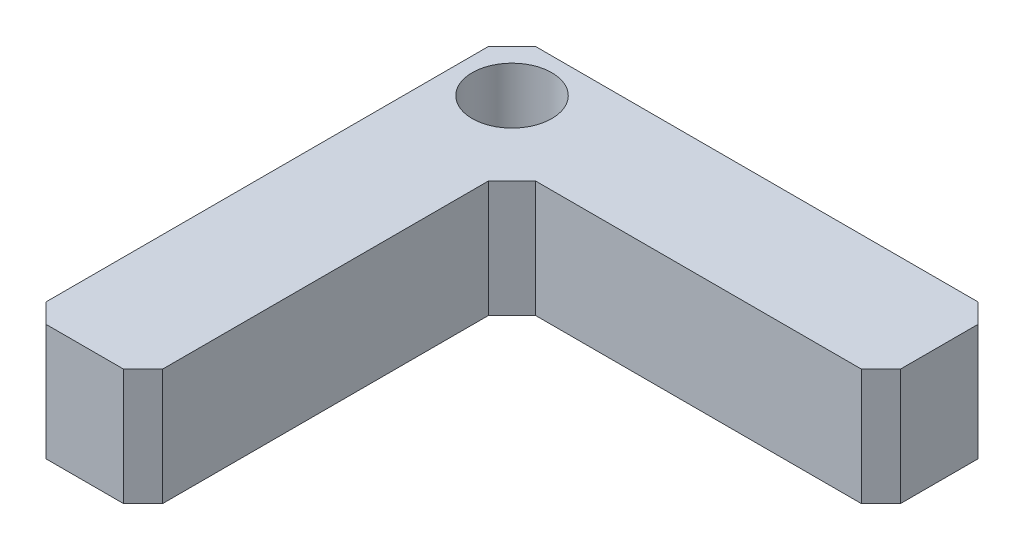
ISO-10303-21;
HEADER;
FILE_DESCRIPTION(('STEP AP214'),'2;1');
FILE_NAME('part.step','',(''),(''),'','','');
FILE_SCHEMA(('AUTOMOTIVE_DESIGN { 1 0 10303 214 1 1 1 1 }'));
ENDSEC;
DATA;
#1=APPLICATION_CONTEXT('core data for automotive mechanical design processes');
#2=APPLICATION_PROTOCOL_DEFINITION('international standard','automotive_design',2000,#1);
#3=PRODUCT_CONTEXT('',#1,'mechanical');
#4=PRODUCT('Part','Part','',(#3));
#5=PRODUCT_RELATED_PRODUCT_CATEGORY('part','',(#4));
#6=PRODUCT_DEFINITION_FORMATION('','',#4);
#7=PRODUCT_DEFINITION_CONTEXT('part definition',#1,'design');
#8=PRODUCT_DEFINITION('design','',#6,#7);
#9=PRODUCT_DEFINITION_SHAPE('','',#8);
#10=(LENGTH_UNIT() NAMED_UNIT(*) SI_UNIT(.MILLI.,.METRE.));
#11=(NAMED_UNIT(*) PLANE_ANGLE_UNIT() SI_UNIT($,.RADIAN.));
#12=(NAMED_UNIT(*) SI_UNIT($,.STERADIAN.) SOLID_ANGLE_UNIT());
#13=UNCERTAINTY_MEASURE_WITH_UNIT(LENGTH_MEASURE(1.E-05),#10,'distance_accuracy_value','');
#14=(GEOMETRIC_REPRESENTATION_CONTEXT(3) GLOBAL_UNCERTAINTY_ASSIGNED_CONTEXT((#13)) GLOBAL_UNIT_ASSIGNED_CONTEXT((#10,
#11,#12)) REPRESENTATION_CONTEXT('',''));
#15=CARTESIAN_POINT('',(0.,0.,0.));
#16=DIRECTION('',(0.,0.,1.));
#17=DIRECTION('',(1.,0.,0.));
#18=AXIS2_PLACEMENT_3D('',#15,#16,#17);
#19=CARTESIAN_POINT('',(-31.5,15.,31.5));
#20=DIRECTION('',(0.707106781186548,0.,-0.707106781186547));
#21=DIRECTION('',(-0.707106781186547,0.,-0.707106781186548));
#22=AXIS2_PLACEMENT_3D('',#19,#20,#21);
#23=PLANE('',#22);
#24=DIRECTION('',(0.707106781186547,0.,0.707106781186548));
#25=VECTOR('',#24,1.);
#26=CARTESIAN_POINT('',(-31.5,0.,31.5));
#27=LINE('',#26,#25);
#28=CARTESIAN_POINT('',(-2.99999999999999,0.,60.));
#29=VERTEX_POINT('',#28);
#30=CARTESIAN_POINT('',(-0.499999999999994,0.,62.5));
#31=VERTEX_POINT('',#30);
#32=EDGE_CURVE('E171',#29,#31,#27,.T.);
#33=ORIENTED_EDGE('',*,*,#32,.T.);
#34=DIRECTION('',(0.,-1.,0.));
#35=VECTOR('',#34,1.);
#36=CARTESIAN_POINT('',(-0.499999999999994,15.,62.5));
#37=LINE('',#36,#35);
#38=CARTESIAN_POINT('',(-0.499999999999994,15.,62.5));
#39=VERTEX_POINT('',#38);
#40=EDGE_CURVE('E11',#39,#31,#37,.T.);
#41=ORIENTED_EDGE('',*,*,#40,.F.);
#42=DIRECTION('',(0.707106781186547,0.,0.707106781186548));
#43=VECTOR('',#42,1.);
#44=CARTESIAN_POINT('',(-31.5,15.,31.5));
#45=LINE('',#44,#43);
#46=CARTESIAN_POINT('',(-2.99999999999999,15.,60.));
#47=VERTEX_POINT('',#46);
#48=EDGE_CURVE('E239',#47,#39,#45,.T.);
#49=ORIENTED_EDGE('',*,*,#48,.F.);
#50=DIRECTION('',(0.,-1.,0.));
#51=VECTOR('',#50,1.);
#52=CARTESIAN_POINT('',(-2.99999999999999,15.,60.));
#53=LINE('',#52,#51);
#54=EDGE_CURVE('E167',#47,#29,#53,.T.);
#55=ORIENTED_EDGE('',*,*,#54,.T.);
#56=EDGE_LOOP('',(#33,#41,#49,#55));
#57=FACE_BOUND('',#56,.T.);
#58=ADVANCED_FACE('F45',(#57),#23,.F.);
#59=CARTESIAN_POINT('',(0.,15.,62.5));
#60=DIRECTION('',(0.,0.,-1.));
#61=DIRECTION('',(-1.,0.,0.));
#62=AXIS2_PLACEMENT_3D('',#59,#60,#61);
#63=PLANE('',#62);
#64=DIRECTION('',(1.,0.,0.));
#65=VECTOR('',#64,1.);
#66=CARTESIAN_POINT('',(0.,0.,62.5));
#67=LINE('',#66,#65);
#68=CARTESIAN_POINT('',(9.50000000000001,0.,62.5));
#69=VERTEX_POINT('',#68);
#70=EDGE_CURVE('E174',#31,#69,#67,.T.);
#71=ORIENTED_EDGE('',*,*,#70,.T.);
#72=DIRECTION('',(0.,-1.,0.));
#73=VECTOR('',#72,1.);
#74=CARTESIAN_POINT('',(9.50000000000001,15.,62.5));
#75=LINE('',#74,#73);
#76=CARTESIAN_POINT('',(9.50000000000001,15.,62.5));
#77=VERTEX_POINT('',#76);
#78=EDGE_CURVE('E54',#77,#69,#75,.T.);
#79=ORIENTED_EDGE('',*,*,#78,.F.);
#80=DIRECTION('',(1.,0.,0.));
#81=VECTOR('',#80,1.);
#82=CARTESIAN_POINT('',(0.,15.,62.5));
#83=LINE('',#82,#81);
#84=EDGE_CURVE('E116',#39,#77,#83,.T.);
#85=ORIENTED_EDGE('',*,*,#84,.F.);
#86=ORIENTED_EDGE('',*,*,#40,.T.);
#87=EDGE_LOOP('',(#71,#79,#85,#86));
#88=FACE_BOUND('',#87,.T.);
#89=ADVANCED_FACE('F222',(#88),#63,.F.);
#90=CARTESIAN_POINT('',(36.,15.,36.));
#91=DIRECTION('',(0.707106781186548,0.,0.707106781186547));
#92=DIRECTION('',(0.707106781186547,0.,-0.707106781186548));
#93=AXIS2_PLACEMENT_3D('',#90,#91,#92);
#94=PLANE('',#93);
#95=DIRECTION('',(-0.707106781186547,0.,0.707106781186548));
#96=VECTOR('',#95,1.);
#97=CARTESIAN_POINT('',(36.,0.,36.));
#98=LINE('',#97,#96);
#99=CARTESIAN_POINT('',(12.,0.,60.));
#100=VERTEX_POINT('',#99);
#101=EDGE_CURVE('E177',#100,#69,#98,.T.);
#102=ORIENTED_EDGE('',*,*,#101,.F.);
#103=DIRECTION('',(0.,-1.,0.));
#104=VECTOR('',#103,1.);
#105=CARTESIAN_POINT('',(12.,15.,60.));
#106=LINE('',#105,#104);
#107=CARTESIAN_POINT('',(12.,15.,60.));
#108=VERTEX_POINT('',#107);
#109=EDGE_CURVE('E215',#108,#100,#106,.T.);
#110=ORIENTED_EDGE('',*,*,#109,.F.);
#111=DIRECTION('',(-0.707106781186547,0.,0.707106781186548));
#112=VECTOR('',#111,1.);
#113=CARTESIAN_POINT('',(36.,15.,36.));
#114=LINE('',#113,#112);
#115=EDGE_CURVE('E221',#108,#77,#114,.T.);
#116=ORIENTED_EDGE('',*,*,#115,.T.);
#117=ORIENTED_EDGE('',*,*,#78,.T.);
#118=EDGE_LOOP('',(#102,#110,#116,#117));
#119=FACE_BOUND('',#118,.T.);
#120=ADVANCED_FACE('F219',(#119),#94,.T.);
#121=CARTESIAN_POINT('',(12.,15.,0.));
#122=DIRECTION('',(1.,0.,0.));
#123=DIRECTION('',(0.,0.,-1.));
#124=AXIS2_PLACEMENT_3D('',#121,#122,#123);
#125=PLANE('',#124);
#126=DIRECTION('',(0.,0.,1.));
#127=VECTOR('',#126,1.);
#128=CARTESIAN_POINT('',(12.,0.,0.));
#129=LINE('',#128,#127);
#130=CARTESIAN_POINT('',(12.,0.,17.998132752231));
#131=VERTEX_POINT('',#130);
#132=EDGE_CURVE('E180',#131,#100,#129,.T.);
#133=ORIENTED_EDGE('',*,*,#132,.F.);
#134=DIRECTION('',(0.,-1.,0.));
#135=VECTOR('',#134,1.);
#136=CARTESIAN_POINT('',(12.,15.,17.998132752231));
#137=LINE('',#136,#135);
#138=CARTESIAN_POINT('',(12.,15.,17.998132752231));
#139=VERTEX_POINT('',#138);
#140=EDGE_CURVE('E213',#139,#131,#137,.T.);
#141=ORIENTED_EDGE('',*,*,#140,.F.);
#142=DIRECTION('',(0.,0.,1.));
#143=VECTOR('',#142,1.);
#144=CARTESIAN_POINT('',(12.,15.,0.));
#145=LINE('',#144,#143);
#146=EDGE_CURVE('E233',#139,#108,#145,.T.);
#147=ORIENTED_EDGE('',*,*,#146,.T.);
#148=ORIENTED_EDGE('',*,*,#109,.T.);
#149=EDGE_LOOP('',(#133,#141,#147,#148));
#150=FACE_BOUND('',#149,.T.);
#151=ADVANCED_FACE('F230',(#150),#125,.T.);
#152=CARTESIAN_POINT('',(14.9990663761155,15.,14.9990663761155));
#153=DIRECTION('',(0.707106781186547,0.,0.707106781186547));
#154=DIRECTION('',(0.707106781186548,0.,-0.707106781186548));
#155=AXIS2_PLACEMENT_3D('',#152,#153,#154);
#156=PLANE('',#155);
#157=DIRECTION('',(-0.707106781186548,0.,0.707106781186548));
#158=VECTOR('',#157,1.);
#159=CARTESIAN_POINT('',(14.9990663761155,0.,14.9990663761155));
#160=LINE('',#159,#158);
#161=CARTESIAN_POINT('',(14.998132752231,0.,15.));
#162=VERTEX_POINT('',#161);
#163=EDGE_CURVE('E183',#162,#131,#160,.T.);
#164=ORIENTED_EDGE('',*,*,#163,.F.);
#165=DIRECTION('',(0.,-1.,0.));
#166=VECTOR('',#165,1.);
#167=CARTESIAN_POINT('',(14.998132752231,15.,15.));
#168=LINE('',#167,#166);
#169=CARTESIAN_POINT('',(14.998132752231,15.,15.));
#170=VERTEX_POINT('',#169);
#171=EDGE_CURVE('E211',#170,#162,#168,.T.);
#172=ORIENTED_EDGE('',*,*,#171,.F.);
#173=DIRECTION('',(-0.707106781186548,0.,0.707106781186548));
#174=VECTOR('',#173,1.);
#175=CARTESIAN_POINT('',(14.9990663761155,15.,14.9990663761155));
#176=LINE('',#175,#174);
#177=EDGE_CURVE('E237',#170,#139,#176,.T.);
#178=ORIENTED_EDGE('',*,*,#177,.T.);
#179=ORIENTED_EDGE('',*,*,#140,.T.);
#180=EDGE_LOOP('',(#164,#172,#178,#179));
#181=FACE_BOUND('',#180,.T.);
#182=ADVANCED_FACE('F283',(#181),#156,.T.);
#183=CARTESIAN_POINT('',(0.,15.,15.));
#184=DIRECTION('',(0.,0.,1.));
#185=DIRECTION('',(1.,0.,0.));
#186=AXIS2_PLACEMENT_3D('',#183,#184,#185);
#187=PLANE('',#186);
#188=DIRECTION('',(-1.,0.,0.));
#189=VECTOR('',#188,1.);
#190=CARTESIAN_POINT('',(0.,0.,15.));
#191=LINE('',#190,#189);
#192=CARTESIAN_POINT('',(57.,0.,15.));
#193=VERTEX_POINT('',#192);
#194=EDGE_CURVE('E186',#193,#162,#191,.T.);
#195=ORIENTED_EDGE('',*,*,#194,.F.);
#196=DIRECTION('',(0.,-1.,0.));
#197=VECTOR('',#196,1.);
#198=CARTESIAN_POINT('',(57.,15.,15.));
#199=LINE('',#198,#197);
#200=CARTESIAN_POINT('',(57.,15.,15.));
#201=VERTEX_POINT('',#200);
#202=EDGE_CURVE('E209',#201,#193,#199,.T.);
#203=ORIENTED_EDGE('',*,*,#202,.F.);
#204=DIRECTION('',(-1.,0.,0.));
#205=VECTOR('',#204,1.);
#206=CARTESIAN_POINT('',(0.,15.,15.));
#207=LINE('',#206,#205);
#208=EDGE_CURVE('E244',#201,#170,#207,.T.);
#209=ORIENTED_EDGE('',*,*,#208,.T.);
#210=ORIENTED_EDGE('',*,*,#171,.T.);
#211=EDGE_LOOP('',(#195,#203,#209,#210));
#212=FACE_BOUND('',#211,.T.);
#213=ADVANCED_FACE('F286',(#212),#187,.T.);
#214=CARTESIAN_POINT('',(36.,15.,36.));
#215=DIRECTION('',(0.707106781186547,0.,0.707106781186547));
#216=DIRECTION('',(0.707106781186548,0.,-0.707106781186548));
#217=AXIS2_PLACEMENT_3D('',#214,#215,#216);
#218=PLANE('',#217);
#219=DIRECTION('',(-0.707106781186548,0.,0.707106781186548));
#220=VECTOR('',#219,1.);
#221=CARTESIAN_POINT('',(36.,0.,36.));
#222=LINE('',#221,#220);
#223=CARTESIAN_POINT('',(59.5,0.,12.5));
#224=VERTEX_POINT('',#223);
#225=EDGE_CURVE('E189',#224,#193,#222,.T.);
#226=ORIENTED_EDGE('',*,*,#225,.F.);
#227=DIRECTION('',(0.,-1.,0.));
#228=VECTOR('',#227,1.);
#229=CARTESIAN_POINT('',(59.5,15.,12.5));
#230=LINE('',#229,#228);
#231=CARTESIAN_POINT('',(59.5,15.,12.5));
#232=VERTEX_POINT('',#231);
#233=EDGE_CURVE('E207',#232,#224,#230,.T.);
#234=ORIENTED_EDGE('',*,*,#233,.F.);
#235=DIRECTION('',(-0.707106781186548,0.,0.707106781186548));
#236=VECTOR('',#235,1.);
#237=CARTESIAN_POINT('',(36.,15.,36.));
#238=LINE('',#237,#236);
#239=EDGE_CURVE('E247',#232,#201,#238,.T.);
#240=ORIENTED_EDGE('',*,*,#239,.T.);
#241=ORIENTED_EDGE('',*,*,#202,.T.);
#242=EDGE_LOOP('',(#226,#234,#240,#241));
#243=FACE_BOUND('',#242,.T.);
#244=ADVANCED_FACE('F290',(#243),#218,.T.);
#245=CARTESIAN_POINT('',(59.5,15.,0.));
#246=DIRECTION('',(1.,0.,0.));
#247=DIRECTION('',(0.,0.,-1.));
#248=AXIS2_PLACEMENT_3D('',#245,#246,#247);
#249=PLANE('',#248);
#250=DIRECTION('',(0.,0.,1.));
#251=VECTOR('',#250,1.);
#252=CARTESIAN_POINT('',(59.5,0.,0.));
#253=LINE('',#252,#251);
#254=CARTESIAN_POINT('',(59.5,0.,2.5));
#255=VERTEX_POINT('',#254);
#256=EDGE_CURVE('E192',#255,#224,#253,.T.);
#257=ORIENTED_EDGE('',*,*,#256,.F.);
#258=DIRECTION('',(0.,-1.,0.));
#259=VECTOR('',#258,1.);
#260=CARTESIAN_POINT('',(59.5,15.,2.5));
#261=LINE('',#260,#259);
#262=CARTESIAN_POINT('',(59.5,15.,2.5));
#263=VERTEX_POINT('',#262);
#264=EDGE_CURVE('E205',#263,#255,#261,.T.);
#265=ORIENTED_EDGE('',*,*,#264,.F.);
#266=DIRECTION('',(0.,0.,1.));
#267=VECTOR('',#266,1.);
#268=CARTESIAN_POINT('',(59.5,15.,0.));
#269=LINE('',#268,#267);
#270=EDGE_CURVE('E162',#263,#232,#269,.T.);
#271=ORIENTED_EDGE('',*,*,#270,.T.);
#272=ORIENTED_EDGE('',*,*,#233,.T.);
#273=EDGE_LOOP('',(#257,#265,#271,#272));
#274=FACE_BOUND('',#273,.T.);
#275=ADVANCED_FACE('F252',(#274),#249,.T.);
#276=CARTESIAN_POINT('',(28.5,15.,-28.5));
#277=DIRECTION('',(0.707106781186547,0.,-0.707106781186548));
#278=DIRECTION('',(-0.707106781186548,0.,-0.707106781186547));
#279=AXIS2_PLACEMENT_3D('',#276,#277,#278);
#280=PLANE('',#279);
#281=DIRECTION('',(0.707106781186548,0.,0.707106781186547));
#282=VECTOR('',#281,1.);
#283=CARTESIAN_POINT('',(28.5,0.,-28.5));
#284=LINE('',#283,#282);
#285=CARTESIAN_POINT('',(57.,0.,0.));
#286=VERTEX_POINT('',#285);
#287=EDGE_CURVE('E195',#286,#255,#284,.T.);
#288=ORIENTED_EDGE('',*,*,#287,.F.);
#289=DIRECTION('',(0.,-1.,0.));
#290=VECTOR('',#289,1.);
#291=CARTESIAN_POINT('',(57.,15.,0.));
#292=LINE('',#291,#290);
#293=CARTESIAN_POINT('',(57.,15.,0.));
#294=VERTEX_POINT('',#293);
#295=EDGE_CURVE('E150',#294,#286,#292,.T.);
#296=ORIENTED_EDGE('',*,*,#295,.F.);
#297=DIRECTION('',(0.707106781186548,0.,0.707106781186547));
#298=VECTOR('',#297,1.);
#299=CARTESIAN_POINT('',(28.5,15.,-28.5));
#300=LINE('',#299,#298);
#301=EDGE_CURVE('E160',#294,#263,#300,.T.);
#302=ORIENTED_EDGE('',*,*,#301,.T.);
#303=ORIENTED_EDGE('',*,*,#264,.T.);
#304=EDGE_LOOP('',(#288,#296,#302,#303));
#305=FACE_BOUND('',#304,.T.);
#306=ADVANCED_FACE('F258',(#305),#280,.T.);
#307=CARTESIAN_POINT('',(0.,15.,0.));
#308=DIRECTION('',(0.,0.,-1.));
#309=DIRECTION('',(-1.,0.,0.));
#310=AXIS2_PLACEMENT_3D('',#307,#308,#309);
#311=PLANE('',#310);
#312=DIRECTION('',(1.,0.,0.));
#313=VECTOR('',#312,1.);
#314=CARTESIAN_POINT('',(0.,0.,0.));
#315=LINE('',#314,#313);
#316=CARTESIAN_POINT('',(0.,0.,0.));
#317=VERTEX_POINT('',#316);
#318=EDGE_CURVE('E149',#317,#286,#315,.T.);
#319=ORIENTED_EDGE('',*,*,#318,.F.);
#320=DIRECTION('',(0.,-1.,0.));
#321=VECTOR('',#320,1.);
#322=CARTESIAN_POINT('',(0.,15.,0.));
#323=LINE('',#322,#321);
#324=CARTESIAN_POINT('',(0.,15.,0.));
#325=VERTEX_POINT('',#324);
#326=EDGE_CURVE('E143',#325,#317,#323,.T.);
#327=ORIENTED_EDGE('',*,*,#326,.F.);
#328=DIRECTION('',(1.,0.,0.));
#329=VECTOR('',#328,1.);
#330=CARTESIAN_POINT('',(0.,15.,0.));
#331=LINE('',#330,#329);
#332=EDGE_CURVE('E147',#325,#294,#331,.T.);
#333=ORIENTED_EDGE('',*,*,#332,.T.);
#334=ORIENTED_EDGE('',*,*,#295,.T.);
#335=EDGE_LOOP('',(#319,#327,#333,#334));
#336=FACE_BOUND('',#335,.T.);
#337=ADVANCED_FACE('F145',(#336),#311,.T.);
#338=CARTESIAN_POINT('',(0.,15.,0.));
#339=DIRECTION('',(0.707106781186547,0.,0.707106781186547));
#340=DIRECTION('',(0.707106781186548,0.,-0.707106781186548));
#341=AXIS2_PLACEMENT_3D('',#338,#339,#340);
#342=PLANE('',#341);
#343=DIRECTION('',(-0.707106781186548,0.,0.707106781186548));
#344=VECTOR('',#343,1.);
#345=CARTESIAN_POINT('',(0.,0.,0.));
#346=LINE('',#345,#344);
#347=CARTESIAN_POINT('',(-3.,0.,3.));
#348=VERTEX_POINT('',#347);
#349=EDGE_CURVE('E102',#317,#348,#346,.T.);
#350=ORIENTED_EDGE('',*,*,#349,.T.);
#351=DIRECTION('',(0.,-1.,0.));
#352=VECTOR('',#351,1.);
#353=CARTESIAN_POINT('',(-3.,15.,3.));
#354=LINE('',#353,#352);
#355=CARTESIAN_POINT('',(-3.,15.,3.));
#356=VERTEX_POINT('',#355);
#357=EDGE_CURVE('E151',#356,#348,#354,.T.);
#358=ORIENTED_EDGE('',*,*,#357,.F.);
#359=DIRECTION('',(-0.707106781186548,0.,0.707106781186548));
#360=VECTOR('',#359,1.);
#361=CARTESIAN_POINT('',(0.,15.,0.));
#362=LINE('',#361,#360);
#363=EDGE_CURVE('E153',#325,#356,#362,.T.);
#364=ORIENTED_EDGE('',*,*,#363,.F.);
#365=ORIENTED_EDGE('',*,*,#326,.T.);
#366=EDGE_LOOP('',(#350,#358,#364,#365));
#367=FACE_BOUND('',#366,.T.);
#368=ADVANCED_FACE('F154',(#367),#342,.F.);
#369=CARTESIAN_POINT('',(4.,15.,7.));
#370=DIRECTION('',(0.,-1.,0.));
#371=DIRECTION('',(0.,0.,-1.));
#372=AXIS2_PLACEMENT_3D('',#369,#370,#371);
#373=CYLINDRICAL_SURFACE('',#372,5.125);
#374=CARTESIAN_POINT('',(4.,15.,7.));
#375=DIRECTION('',(0.,1.,0.));
#376=DIRECTION('',(0.,0.,1.));
#377=AXIS2_PLACEMENT_3D('',#374,#375,#376);
#378=CIRCLE('',#377,5.125);
#379=CARTESIAN_POINT('',(4.,15.,12.125));
#380=VERTEX_POINT('',#379);
#381=EDGE_CURVE('E201',#380,#380,#378,.T.);
#382=ORIENTED_EDGE('',*,*,#381,.T.);
#383=EDGE_LOOP('',(#382));
#384=FACE_BOUND('',#383,.T.);
#385=CARTESIAN_POINT('',(4.,0.,7.));
#386=DIRECTION('',(0.,1.,0.));
#387=DIRECTION('',(0.,0.,1.));
#388=AXIS2_PLACEMENT_3D('',#385,#386,#387);
#389=CIRCLE('',#388,5.125);
#390=CARTESIAN_POINT('',(4.,0.,12.125));
#391=VERTEX_POINT('',#390);
#392=EDGE_CURVE('E168',#391,#391,#389,.T.);
#393=ORIENTED_EDGE('',*,*,#392,.F.);
#394=EDGE_LOOP('',(#393));
#395=FACE_BOUND('',#394,.T.);
#396=ADVANCED_FACE('F47',(#384,#395),#373,.F.);
#397=CARTESIAN_POINT('',(-3.,15.,0.));
#398=DIRECTION('',(1.,0.,0.));
#399=DIRECTION('',(0.,0.,-1.));
#400=AXIS2_PLACEMENT_3D('',#397,#398,#399);
#401=PLANE('',#400);
#402=DIRECTION('',(0.,0.,1.));
#403=VECTOR('',#402,1.);
#404=CARTESIAN_POINT('',(-3.,0.,0.));
#405=LINE('',#404,#403);
#406=EDGE_CURVE('E108',#348,#29,#405,.T.);
#407=ORIENTED_EDGE('',*,*,#406,.T.);
#408=ORIENTED_EDGE('',*,*,#54,.F.);
#409=DIRECTION('',(0.,0.,1.));
#410=VECTOR('',#409,1.);
#411=CARTESIAN_POINT('',(-3.,15.,0.));
#412=LINE('',#411,#410);
#413=EDGE_CURVE('E62',#356,#47,#412,.T.);
#414=ORIENTED_EDGE('',*,*,#413,.F.);
#415=ORIENTED_EDGE('',*,*,#357,.T.);
#416=EDGE_LOOP('',(#407,#408,#414,#415));
#417=FACE_BOUND('',#416,.T.);
#418=ADVANCED_FACE('F261',(#417),#401,.F.);
#419=CARTESIAN_POINT('',(0.,15.,0.));
#420=DIRECTION('',(0.,1.,0.));
#421=DIRECTION('',(0.,0.,1.));
#422=AXIS2_PLACEMENT_3D('',#419,#420,#421);
#423=PLANE('',#422);
#424=ORIENTED_EDGE('',*,*,#381,.F.);
#425=EDGE_LOOP('',(#424));
#426=FACE_BOUND('',#425,.T.);
#427=ORIENTED_EDGE('',*,*,#48,.T.);
#428=ORIENTED_EDGE('',*,*,#84,.T.);
#429=ORIENTED_EDGE('',*,*,#115,.F.);
#430=ORIENTED_EDGE('',*,*,#146,.F.);
#431=ORIENTED_EDGE('',*,*,#177,.F.);
#432=ORIENTED_EDGE('',*,*,#208,.F.);
#433=ORIENTED_EDGE('',*,*,#239,.F.);
#434=ORIENTED_EDGE('',*,*,#270,.F.);
#435=ORIENTED_EDGE('',*,*,#301,.F.);
#436=ORIENTED_EDGE('',*,*,#332,.F.);
#437=ORIENTED_EDGE('',*,*,#363,.T.);
#438=ORIENTED_EDGE('',*,*,#413,.T.);
#439=EDGE_LOOP('',(#427,#428,#429,#430,#431,#432,#433,#434,#435,#436,#437,#438));
#440=FACE_BOUND('',#439,.T.);
#441=ADVANCED_FACE('F157',(#426,#440),#423,.T.);
#442=CARTESIAN_POINT('',(0.,0.,0.));
#443=DIRECTION('',(0.,1.,0.));
#444=DIRECTION('',(0.,0.,1.));
#445=AXIS2_PLACEMENT_3D('',#442,#443,#444);
#446=PLANE('',#445);
#447=ORIENTED_EDGE('',*,*,#392,.T.);
#448=EDGE_LOOP('',(#447));
#449=FACE_BOUND('',#448,.T.);
#450=ORIENTED_EDGE('',*,*,#32,.F.);
#451=ORIENTED_EDGE('',*,*,#406,.F.);
#452=ORIENTED_EDGE('',*,*,#349,.F.);
#453=ORIENTED_EDGE('',*,*,#318,.T.);
#454=ORIENTED_EDGE('',*,*,#287,.T.);
#455=ORIENTED_EDGE('',*,*,#256,.T.);
#456=ORIENTED_EDGE('',*,*,#225,.T.);
#457=ORIENTED_EDGE('',*,*,#194,.T.);
#458=ORIENTED_EDGE('',*,*,#163,.T.);
#459=ORIENTED_EDGE('',*,*,#132,.T.);
#460=ORIENTED_EDGE('',*,*,#101,.T.);
#461=ORIENTED_EDGE('',*,*,#70,.F.);
#462=EDGE_LOOP('',(#450,#451,#452,#453,#454,#455,#456,#457,#458,#459,#460,#461));
#463=FACE_BOUND('',#462,.T.);
#464=ADVANCED_FACE('F226',(#449,#463),#446,.F.);
#465=CLOSED_SHELL('',(#58,#89,#120,#151,#182,#213,#244,#275,#306,#337,#368,#396,#418,#441,#464));
#466=MANIFOLD_SOLID_BREP('B2',#465);
#467=ADVANCED_BREP_SHAPE_REPRESENTATION('',(#18,#466),#14);
#468=SHAPE_DEFINITION_REPRESENTATION(#9,#467);
ENDSEC;
END-ISO-10303-21;
